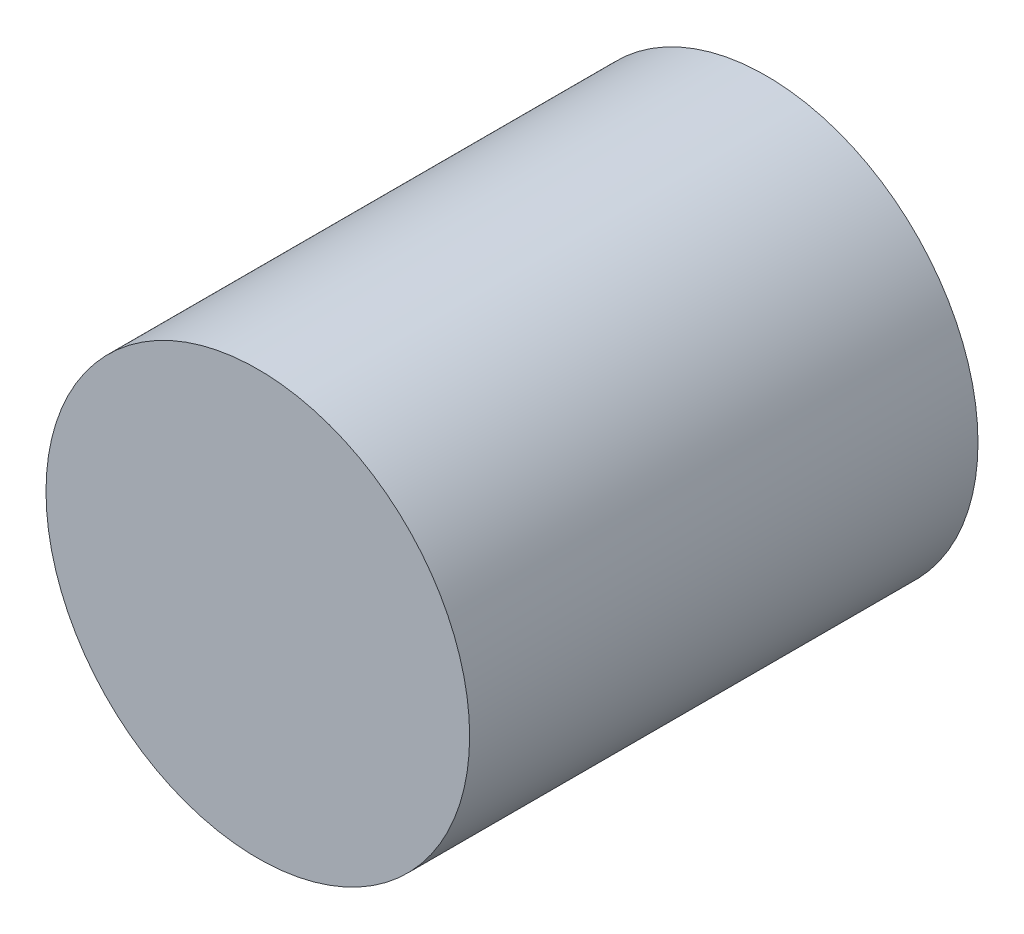
ISO-10303-21;
HEADER;
FILE_DESCRIPTION(('STEP AP214'),'2;1');
FILE_NAME('part.step','',(''),(''),'','','');
FILE_SCHEMA(('AUTOMOTIVE_DESIGN { 1 0 10303 214 1 1 1 1 }'));
ENDSEC;
DATA;
#1=APPLICATION_CONTEXT('core data for automotive mechanical design processes');
#2=APPLICATION_PROTOCOL_DEFINITION('international standard','automotive_design',2000,#1);
#3=PRODUCT_CONTEXT('',#1,'mechanical');
#4=PRODUCT('Part','Part','',(#3));
#5=PRODUCT_RELATED_PRODUCT_CATEGORY('part','',(#4));
#6=PRODUCT_DEFINITION_FORMATION('','',#4);
#7=PRODUCT_DEFINITION_CONTEXT('part definition',#1,'design');
#8=PRODUCT_DEFINITION('design','',#6,#7);
#9=PRODUCT_DEFINITION_SHAPE('','',#8);
#10=(LENGTH_UNIT() NAMED_UNIT(*) SI_UNIT(.MILLI.,.METRE.));
#11=(NAMED_UNIT(*) PLANE_ANGLE_UNIT() SI_UNIT($,.RADIAN.));
#12=(NAMED_UNIT(*) SI_UNIT($,.STERADIAN.) SOLID_ANGLE_UNIT());
#13=UNCERTAINTY_MEASURE_WITH_UNIT(LENGTH_MEASURE(1.E-05),#10,'distance_accuracy_value','');
#14=(GEOMETRIC_REPRESENTATION_CONTEXT(3) GLOBAL_UNCERTAINTY_ASSIGNED_CONTEXT((#13)) GLOBAL_UNIT_ASSIGNED_CONTEXT((#10,
#11,#12)) REPRESENTATION_CONTEXT('',''));
#15=CARTESIAN_POINT('',(0.,0.,0.));
#16=DIRECTION('',(0.,0.,1.));
#17=DIRECTION('',(1.,0.,0.));
#18=AXIS2_PLACEMENT_3D('',#15,#16,#17);
#19=CARTESIAN_POINT('',(0.,0.,12.));
#20=DIRECTION('',(0.,0.,-1.));
#21=DIRECTION('',(-1.,0.,0.));
#22=AXIS2_PLACEMENT_3D('',#19,#20,#21);
#23=CYLINDRICAL_SURFACE('',#22,5.);
#24=CARTESIAN_POINT('',(0.,0.,12.));
#25=DIRECTION('',(0.,0.,1.));
#26=DIRECTION('',(1.,0.,0.));
#27=AXIS2_PLACEMENT_3D('',#24,#25,#26);
#28=CIRCLE('',#27,5.);
#29=CARTESIAN_POINT('',(5.,0.,12.));
#30=VERTEX_POINT('',#29);
#31=EDGE_CURVE('E10',#30,#30,#28,.T.);
#32=ORIENTED_EDGE('',*,*,#31,.F.);
#33=EDGE_LOOP('',(#32));
#34=FACE_BOUND('',#33,.T.);
#35=CARTESIAN_POINT('',(0.,0.,0.));
#36=DIRECTION('',(0.,0.,1.));
#37=DIRECTION('',(1.,0.,0.));
#38=AXIS2_PLACEMENT_3D('',#35,#36,#37);
#39=CIRCLE('',#38,5.);
#40=CARTESIAN_POINT('',(5.,0.,0.));
#41=VERTEX_POINT('',#40);
#42=EDGE_CURVE('E44',#41,#41,#39,.T.);
#43=ORIENTED_EDGE('',*,*,#42,.T.);
#44=EDGE_LOOP('',(#43));
#45=FACE_BOUND('',#44,.T.);
#46=ADVANCED_FACE('F41',(#34,#45),#23,.T.);
#47=CARTESIAN_POINT('',(0.,0.,12.));
#48=DIRECTION('',(0.,0.,1.));
#49=DIRECTION('',(1.,0.,0.));
#50=AXIS2_PLACEMENT_3D('',#47,#48,#49);
#51=PLANE('',#50);
#52=ORIENTED_EDGE('',*,*,#31,.T.);
#53=EDGE_LOOP('',(#52));
#54=FACE_BOUND('',#53,.T.);
#55=ADVANCED_FACE('F58',(#54),#51,.T.);
#56=CARTESIAN_POINT('',(0.,0.,0.));
#57=DIRECTION('',(0.,0.,1.));
#58=DIRECTION('',(1.,0.,0.));
#59=AXIS2_PLACEMENT_3D('',#56,#57,#58);
#60=PLANE('',#59);
#61=ORIENTED_EDGE('',*,*,#42,.F.);
#62=EDGE_LOOP('',(#61));
#63=FACE_BOUND('',#62,.T.);
#64=ADVANCED_FACE('F56',(#63),#60,.F.);
#65=CLOSED_SHELL('',(#46,#55,#64));
#66=MANIFOLD_SOLID_BREP('B2',#65);
#67=ADVANCED_BREP_SHAPE_REPRESENTATION('',(#18,#66),#14);
#68=SHAPE_DEFINITION_REPRESENTATION(#9,#67);
ENDSEC;
END-ISO-10303-21;
